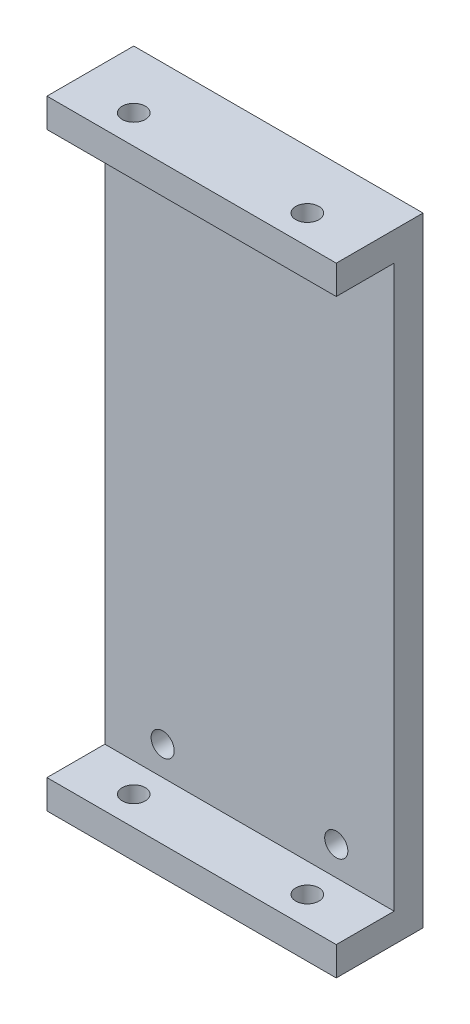
ISO-10303-21;
HEADER;
FILE_DESCRIPTION(('STEP AP214'),'2;1');
FILE_NAME('part.step','',(''),(''),'','','');
FILE_SCHEMA(('AUTOMOTIVE_DESIGN { 1 0 10303 214 1 1 1 1 }'));
ENDSEC;
DATA;
#1=APPLICATION_CONTEXT('core data for automotive mechanical design processes');
#2=APPLICATION_PROTOCOL_DEFINITION('international standard','automotive_design',2000,#1);
#3=PRODUCT_CONTEXT('',#1,'mechanical');
#4=PRODUCT('Part','Part','',(#3));
#5=PRODUCT_RELATED_PRODUCT_CATEGORY('part','',(#4));
#6=PRODUCT_DEFINITION_FORMATION('','',#4);
#7=PRODUCT_DEFINITION_CONTEXT('part definition',#1,'design');
#8=PRODUCT_DEFINITION('design','',#6,#7);
#9=PRODUCT_DEFINITION_SHAPE('','',#8);
#10=(LENGTH_UNIT() NAMED_UNIT(*) SI_UNIT(.MILLI.,.METRE.));
#11=(NAMED_UNIT(*) PLANE_ANGLE_UNIT() SI_UNIT($,.RADIAN.));
#12=(NAMED_UNIT(*) SI_UNIT($,.STERADIAN.) SOLID_ANGLE_UNIT());
#13=UNCERTAINTY_MEASURE_WITH_UNIT(LENGTH_MEASURE(1.E-05),#10,'distance_accuracy_value','');
#14=(GEOMETRIC_REPRESENTATION_CONTEXT(3) GLOBAL_UNCERTAINTY_ASSIGNED_CONTEXT((#13)) GLOBAL_UNIT_ASSIGNED_CONTEXT((#10,
#11,#12)) REPRESENTATION_CONTEXT('',''));
#15=CARTESIAN_POINT('',(0.,0.,0.));
#16=DIRECTION('',(0.,0.,1.));
#17=DIRECTION('',(1.,0.,0.));
#18=AXIS2_PLACEMENT_3D('',#15,#16,#17);
#19=CARTESIAN_POINT('',(0.,0.,0.));
#20=DIRECTION('',(0.,-1.,0.));
#21=DIRECTION('',(0.,0.,-1.));
#22=AXIS2_PLACEMENT_3D('',#19,#20,#21);
#23=PLANE('',#22);
#24=CARTESIAN_POINT('',(-15.,0.,2.5));
#25=DIRECTION('',(0.,1.,0.));
#26=DIRECTION('',(0.,0.,1.));
#27=AXIS2_PLACEMENT_3D('',#24,#25,#26);
#28=CIRCLE('',#27,1.99999999999999);
#29=CARTESIAN_POINT('',(-15.,0.,4.49999999999999));
#30=VERTEX_POINT('',#29);
#31=EDGE_CURVE('E372',#30,#30,#28,.T.);
#32=ORIENTED_EDGE('',*,*,#31,.F.);
#33=EDGE_LOOP('',(#32));
#34=FACE_BOUND('',#33,.T.);
#35=CARTESIAN_POINT('',(15.,0.,2.5));
#36=DIRECTION('',(0.,1.,0.));
#37=DIRECTION('',(0.,0.,1.));
#38=AXIS2_PLACEMENT_3D('',#35,#36,#37);
#39=CIRCLE('',#38,1.99999999999999);
#40=CARTESIAN_POINT('',(15.,0.,4.49999999999999));
#41=VERTEX_POINT('',#40);
#42=EDGE_CURVE('E369',#41,#41,#39,.T.);
#43=ORIENTED_EDGE('',*,*,#42,.F.);
#44=EDGE_LOOP('',(#43));
#45=FACE_BOUND('',#44,.T.);
#46=DIRECTION('',(1.,0.,0.));
#47=VECTOR('',#46,1.);
#48=CARTESIAN_POINT('',(-25.,0.,-2.5));
#49=LINE('',#48,#47);
#50=CARTESIAN_POINT('',(-25.,0.,-2.5));
#51=VERTEX_POINT('',#50);
#52=CARTESIAN_POINT('',(25.,0.,-2.5));
#53=VERTEX_POINT('',#52);
#54=EDGE_CURVE('E57',#51,#53,#49,.T.);
#55=ORIENTED_EDGE('',*,*,#54,.F.);
#56=DIRECTION('',(0.,0.,1.));
#57=VECTOR('',#56,1.);
#58=CARTESIAN_POINT('',(-25.,0.,7.5));
#59=LINE('',#58,#57);
#60=CARTESIAN_POINT('',(-25.,0.,7.5));
#61=VERTEX_POINT('',#60);
#62=EDGE_CURVE('E162',#51,#61,#59,.T.);
#63=ORIENTED_EDGE('',*,*,#62,.T.);
#64=DIRECTION('',(1.,0.,0.));
#65=VECTOR('',#64,1.);
#66=CARTESIAN_POINT('',(-25.,0.,7.5));
#67=LINE('',#66,#65);
#68=CARTESIAN_POINT('',(25.,0.,7.5));
#69=VERTEX_POINT('',#68);
#70=EDGE_CURVE('E154',#61,#69,#67,.T.);
#71=ORIENTED_EDGE('',*,*,#70,.T.);
#72=DIRECTION('',(0.,0.,-1.));
#73=VECTOR('',#72,1.);
#74=CARTESIAN_POINT('',(25.,0.,7.5));
#75=LINE('',#74,#73);
#76=EDGE_CURVE('E151',#69,#53,#75,.T.);
#77=ORIENTED_EDGE('',*,*,#76,.T.);
#78=EDGE_LOOP('',(#55,#63,#71,#77));
#79=FACE_BOUND('',#78,.T.);
#80=ADVANCED_FACE('F39',(#34,#45,#79),#23,.F.);
#81=CARTESIAN_POINT('',(25.,-5.,7.5));
#82=DIRECTION('',(1.,0.,0.));
#83=DIRECTION('',(0.,0.,-1.));
#84=AXIS2_PLACEMENT_3D('',#81,#82,#83);
#85=PLANE('',#84);
#86=ORIENTED_EDGE('',*,*,#76,.F.);
#87=DIRECTION('',(0.,1.,0.));
#88=VECTOR('',#87,1.);
#89=CARTESIAN_POINT('',(25.,-5.,7.5));
#90=LINE('',#89,#88);
#91=CARTESIAN_POINT('',(25.,-5.,7.5));
#92=VERTEX_POINT('',#91);
#93=EDGE_CURVE('E11',#92,#69,#90,.T.);
#94=ORIENTED_EDGE('',*,*,#93,.F.);
#95=DIRECTION('',(0.,0.,-1.));
#96=VECTOR('',#95,1.);
#97=CARTESIAN_POINT('',(25.,-5.,7.5));
#98=LINE('',#97,#96);
#99=CARTESIAN_POINT('',(25.,-5.,-7.5));
#100=VERTEX_POINT('',#99);
#101=EDGE_CURVE('E155',#92,#100,#98,.T.);
#102=ORIENTED_EDGE('',*,*,#101,.T.);
#103=DIRECTION('',(0.,1.,0.));
#104=VECTOR('',#103,1.);
#105=CARTESIAN_POINT('',(25.,-5.,-7.5));
#106=LINE('',#105,#104);
#107=CARTESIAN_POINT('',(25.,102.,-7.5));
#108=VERTEX_POINT('',#107);
#109=EDGE_CURVE('E43',#100,#108,#106,.T.);
#110=ORIENTED_EDGE('',*,*,#109,.T.);
#111=DIRECTION('',(0.,0.,-1.));
#112=VECTOR('',#111,1.);
#113=CARTESIAN_POINT('',(25.,102.,-7.5));
#114=LINE('',#113,#112);
#115=CARTESIAN_POINT('',(25.,102.,7.5));
#116=VERTEX_POINT('',#115);
#117=EDGE_CURVE('E125',#116,#108,#114,.T.);
#118=ORIENTED_EDGE('',*,*,#117,.F.);
#119=DIRECTION('',(0.,-1.,0.));
#120=VECTOR('',#119,1.);
#121=CARTESIAN_POINT('',(25.,102.,7.5));
#122=LINE('',#121,#120);
#123=CARTESIAN_POINT('',(25.,97.,7.5));
#124=VERTEX_POINT('',#123);
#125=EDGE_CURVE('E120',#116,#124,#122,.T.);
#126=ORIENTED_EDGE('',*,*,#125,.T.);
#127=DIRECTION('',(0.,0.,-1.));
#128=VECTOR('',#127,1.);
#129=CARTESIAN_POINT('',(25.,97.,-7.5));
#130=LINE('',#129,#128);
#131=CARTESIAN_POINT('',(25.,97.,-2.5));
#132=VERTEX_POINT('',#131);
#133=EDGE_CURVE('E128',#124,#132,#130,.T.);
#134=ORIENTED_EDGE('',*,*,#133,.T.);
#135=DIRECTION('',(0.,-1.,0.));
#136=VECTOR('',#135,1.);
#137=CARTESIAN_POINT('',(25.,97.,-2.5));
#138=LINE('',#137,#136);
#139=EDGE_CURVE('E145',#132,#53,#138,.T.);
#140=ORIENTED_EDGE('',*,*,#139,.T.);
#141=EDGE_LOOP('',(#86,#94,#102,#110,#118,#126,#134,#140));
#142=FACE_BOUND('',#141,.T.);
#143=ADVANCED_FACE('F41',(#142),#85,.T.);
#144=CARTESIAN_POINT('',(-25.,-5.,7.5));
#145=DIRECTION('',(0.,0.,1.));
#146=DIRECTION('',(1.,0.,0.));
#147=AXIS2_PLACEMENT_3D('',#144,#145,#146);
#148=PLANE('',#147);
#149=ORIENTED_EDGE('',*,*,#70,.F.);
#150=DIRECTION('',(0.,1.,0.));
#151=VECTOR('',#150,1.);
#152=CARTESIAN_POINT('',(-25.,-5.,7.5));
#153=LINE('',#152,#151);
#154=CARTESIAN_POINT('',(-25.,-5.,7.5));
#155=VERTEX_POINT('',#154);
#156=EDGE_CURVE('E48',#155,#61,#153,.T.);
#157=ORIENTED_EDGE('',*,*,#156,.F.);
#158=DIRECTION('',(1.,0.,0.));
#159=VECTOR('',#158,1.);
#160=CARTESIAN_POINT('',(-25.,-5.,7.5));
#161=LINE('',#160,#159);
#162=EDGE_CURVE('E159',#155,#92,#161,.T.);
#163=ORIENTED_EDGE('',*,*,#162,.T.);
#164=ORIENTED_EDGE('',*,*,#93,.T.);
#165=EDGE_LOOP('',(#149,#157,#163,#164));
#166=FACE_BOUND('',#165,.T.);
#167=ADVANCED_FACE('F185',(#166),#148,.T.);
#168=CARTESIAN_POINT('',(-25.,-5.,7.5));
#169=DIRECTION('',(-1.,0.,0.));
#170=DIRECTION('',(0.,0.,1.));
#171=AXIS2_PLACEMENT_3D('',#168,#169,#170);
#172=PLANE('',#171);
#173=ORIENTED_EDGE('',*,*,#62,.F.);
#174=DIRECTION('',(0.,-1.,0.));
#175=VECTOR('',#174,1.);
#176=CARTESIAN_POINT('',(-25.,97.,-2.5));
#177=LINE('',#176,#175);
#178=CARTESIAN_POINT('',(-25.,97.,-2.5));
#179=VERTEX_POINT('',#178);
#180=EDGE_CURVE('E146',#179,#51,#177,.T.);
#181=ORIENTED_EDGE('',*,*,#180,.F.);
#182=DIRECTION('',(0.,0.,1.));
#183=VECTOR('',#182,1.);
#184=CARTESIAN_POINT('',(-25.,97.,-7.5));
#185=LINE('',#184,#183);
#186=CARTESIAN_POINT('',(-25.,97.,7.5));
#187=VERTEX_POINT('',#186);
#188=EDGE_CURVE('E132',#179,#187,#185,.T.);
#189=ORIENTED_EDGE('',*,*,#188,.T.);
#190=DIRECTION('',(0.,-1.,0.));
#191=VECTOR('',#190,1.);
#192=CARTESIAN_POINT('',(-25.,102.,7.5));
#193=LINE('',#192,#191);
#194=CARTESIAN_POINT('',(-25.,102.,7.5));
#195=VERTEX_POINT('',#194);
#196=EDGE_CURVE('E119',#195,#187,#193,.T.);
#197=ORIENTED_EDGE('',*,*,#196,.F.);
#198=DIRECTION('',(0.,0.,1.));
#199=VECTOR('',#198,1.);
#200=CARTESIAN_POINT('',(-25.,102.,-7.5));
#201=LINE('',#200,#199);
#202=CARTESIAN_POINT('',(-25.,102.,-7.5));
#203=VERTEX_POINT('',#202);
#204=EDGE_CURVE('E121',#203,#195,#201,.T.);
#205=ORIENTED_EDGE('',*,*,#204,.F.);
#206=DIRECTION('',(0.,1.,0.));
#207=VECTOR('',#206,1.);
#208=CARTESIAN_POINT('',(-25.,-5.,-7.5));
#209=LINE('',#208,#207);
#210=CARTESIAN_POINT('',(-25.,-5.,-7.5));
#211=VERTEX_POINT('',#210);
#212=EDGE_CURVE('E169',#211,#203,#209,.T.);
#213=ORIENTED_EDGE('',*,*,#212,.F.);
#214=DIRECTION('',(0.,0.,1.));
#215=VECTOR('',#214,1.);
#216=CARTESIAN_POINT('',(-25.,-5.,7.5));
#217=LINE('',#216,#215);
#218=EDGE_CURVE('E160',#211,#155,#217,.T.);
#219=ORIENTED_EDGE('',*,*,#218,.T.);
#220=ORIENTED_EDGE('',*,*,#156,.T.);
#221=EDGE_LOOP('',(#173,#181,#189,#197,#205,#213,#219,#220));
#222=FACE_BOUND('',#221,.T.);
#223=ADVANCED_FACE('F131',(#222),#172,.T.);
#224=CARTESIAN_POINT('',(-25.,-5.,-7.5));
#225=DIRECTION('',(0.,0.,-1.));
#226=DIRECTION('',(-1.,0.,0.));
#227=AXIS2_PLACEMENT_3D('',#224,#225,#226);
#228=PLANE('',#227);
#229=CARTESIAN_POINT('',(-15.,5.,-7.5));
#230=DIRECTION('',(0.,0.,1.));
#231=DIRECTION('',(1.,0.,0.));
#232=AXIS2_PLACEMENT_3D('',#229,#230,#231);
#233=CIRCLE('',#232,1.99999999999999);
#234=CARTESIAN_POINT('',(-13.,5.,-7.5));
#235=VERTEX_POINT('',#234);
#236=EDGE_CURVE('E357',#235,#235,#233,.T.);
#237=ORIENTED_EDGE('',*,*,#236,.T.);
#238=EDGE_LOOP('',(#237));
#239=FACE_BOUND('',#238,.T.);
#240=CARTESIAN_POINT('',(15.,5.,-7.5));
#241=DIRECTION('',(0.,0.,1.));
#242=DIRECTION('',(1.,0.,0.));
#243=AXIS2_PLACEMENT_3D('',#240,#241,#242);
#244=CIRCLE('',#243,1.99999999999999);
#245=CARTESIAN_POINT('',(17.,5.,-7.5));
#246=VERTEX_POINT('',#245);
#247=EDGE_CURVE('E353',#246,#246,#244,.T.);
#248=ORIENTED_EDGE('',*,*,#247,.T.);
#249=EDGE_LOOP('',(#248));
#250=FACE_BOUND('',#249,.T.);
#251=CARTESIAN_POINT('',(-15.,92.,-7.50000000000001));
#252=DIRECTION('',(0.,0.,1.));
#253=DIRECTION('',(1.,0.,0.));
#254=AXIS2_PLACEMENT_3D('',#251,#252,#253);
#255=CIRCLE('',#254,1.99999999999999);
#256=CARTESIAN_POINT('',(-13.,92.,-7.50000000000001));
#257=VERTEX_POINT('',#256);
#258=EDGE_CURVE('E346',#257,#257,#255,.T.);
#259=ORIENTED_EDGE('',*,*,#258,.T.);
#260=EDGE_LOOP('',(#259));
#261=FACE_BOUND('',#260,.T.);
#262=CARTESIAN_POINT('',(15.,92.,-7.5));
#263=DIRECTION('',(0.,0.,1.));
#264=DIRECTION('',(1.,0.,0.));
#265=AXIS2_PLACEMENT_3D('',#262,#263,#264);
#266=CIRCLE('',#265,1.99999999999999);
#267=CARTESIAN_POINT('',(17.,92.,-7.5));
#268=VERTEX_POINT('',#267);
#269=EDGE_CURVE('E345',#268,#268,#266,.T.);
#270=ORIENTED_EDGE('',*,*,#269,.T.);
#271=EDGE_LOOP('',(#270));
#272=FACE_BOUND('',#271,.T.);
#273=ORIENTED_EDGE('',*,*,#212,.T.);
#274=DIRECTION('',(-1.,0.,0.));
#275=VECTOR('',#274,1.);
#276=CARTESIAN_POINT('',(-25.,102.,-7.5));
#277=LINE('',#276,#275);
#278=EDGE_CURVE('E126',#108,#203,#277,.T.);
#279=ORIENTED_EDGE('',*,*,#278,.F.);
#280=ORIENTED_EDGE('',*,*,#109,.F.);
#281=DIRECTION('',(-1.,0.,0.));
#282=VECTOR('',#281,1.);
#283=CARTESIAN_POINT('',(-25.,-5.,-7.5));
#284=LINE('',#283,#282);
#285=EDGE_CURVE('E152',#100,#211,#284,.T.);
#286=ORIENTED_EDGE('',*,*,#285,.T.);
#287=EDGE_LOOP('',(#273,#279,#280,#286));
#288=FACE_BOUND('',#287,.T.);
#289=ADVANCED_FACE('F168',(#239,#250,#261,#272,#288),#228,.T.);
#290=CARTESIAN_POINT('',(0.,-5.,0.));
#291=DIRECTION('',(0.,-1.,0.));
#292=DIRECTION('',(0.,0.,-1.));
#293=AXIS2_PLACEMENT_3D('',#290,#291,#292);
#294=PLANE('',#293);
#295=CARTESIAN_POINT('',(-15.,-5.00000000000001,2.5));
#296=DIRECTION('',(0.,1.,0.));
#297=DIRECTION('',(0.,0.,1.));
#298=AXIS2_PLACEMENT_3D('',#295,#296,#297);
#299=CIRCLE('',#298,1.99999999999999);
#300=CARTESIAN_POINT('',(-15.,-5.00000000000001,4.49999999999999));
#301=VERTEX_POINT('',#300);
#302=EDGE_CURVE('E375',#301,#301,#299,.T.);
#303=ORIENTED_EDGE('',*,*,#302,.T.);
#304=EDGE_LOOP('',(#303));
#305=FACE_BOUND('',#304,.T.);
#306=CARTESIAN_POINT('',(15.,-5.00000000000001,2.5));
#307=DIRECTION('',(0.,1.,0.));
#308=DIRECTION('',(0.,0.,1.));
#309=AXIS2_PLACEMENT_3D('',#306,#307,#308);
#310=CIRCLE('',#309,1.99999999999999);
#311=CARTESIAN_POINT('',(15.,-5.00000000000001,4.49999999999999));
#312=VERTEX_POINT('',#311);
#313=EDGE_CURVE('E368',#312,#312,#310,.T.);
#314=ORIENTED_EDGE('',*,*,#313,.T.);
#315=EDGE_LOOP('',(#314));
#316=FACE_BOUND('',#315,.T.);
#317=ORIENTED_EDGE('',*,*,#101,.F.);
#318=ORIENTED_EDGE('',*,*,#162,.F.);
#319=ORIENTED_EDGE('',*,*,#218,.F.);
#320=ORIENTED_EDGE('',*,*,#285,.F.);
#321=EDGE_LOOP('',(#317,#318,#319,#320));
#322=FACE_BOUND('',#321,.T.);
#323=ADVANCED_FACE('F189',(#305,#316,#322),#294,.T.);
#324=CARTESIAN_POINT('',(-25.,97.,-2.5));
#325=DIRECTION('',(0.,0.,-1.));
#326=DIRECTION('',(-1.,0.,0.));
#327=AXIS2_PLACEMENT_3D('',#324,#325,#326);
#328=PLANE('',#327);
#329=CARTESIAN_POINT('',(-15.,5.,-2.5));
#330=DIRECTION('',(0.,0.,1.));
#331=DIRECTION('',(1.,0.,0.));
#332=AXIS2_PLACEMENT_3D('',#329,#330,#331);
#333=CIRCLE('',#332,1.99999999999999);
#334=CARTESIAN_POINT('',(-13.,5.,-2.5));
#335=VERTEX_POINT('',#334);
#336=EDGE_CURVE('E361',#335,#335,#333,.T.);
#337=ORIENTED_EDGE('',*,*,#336,.F.);
#338=EDGE_LOOP('',(#337));
#339=FACE_BOUND('',#338,.T.);
#340=CARTESIAN_POINT('',(15.,5.,-2.5));
#341=DIRECTION('',(0.,0.,1.));
#342=DIRECTION('',(1.,0.,0.));
#343=AXIS2_PLACEMENT_3D('',#340,#341,#342);
#344=CIRCLE('',#343,1.99999999999999);
#345=CARTESIAN_POINT('',(17.,5.,-2.5));
#346=VERTEX_POINT('',#345);
#347=EDGE_CURVE('E360',#346,#346,#344,.T.);
#348=ORIENTED_EDGE('',*,*,#347,.F.);
#349=EDGE_LOOP('',(#348));
#350=FACE_BOUND('',#349,.T.);
#351=CARTESIAN_POINT('',(-15.,92.,-2.5));
#352=DIRECTION('',(0.,0.,1.));
#353=DIRECTION('',(1.,0.,0.));
#354=AXIS2_PLACEMENT_3D('',#351,#352,#353);
#355=CIRCLE('',#354,1.99999999999999);
#356=CARTESIAN_POINT('',(-13.,92.,-2.5));
#357=VERTEX_POINT('',#356);
#358=EDGE_CURVE('E354',#357,#357,#355,.T.);
#359=ORIENTED_EDGE('',*,*,#358,.F.);
#360=EDGE_LOOP('',(#359));
#361=FACE_BOUND('',#360,.T.);
#362=CARTESIAN_POINT('',(15.,92.,-2.5));
#363=DIRECTION('',(0.,0.,1.));
#364=DIRECTION('',(1.,0.,0.));
#365=AXIS2_PLACEMENT_3D('',#362,#363,#364);
#366=CIRCLE('',#365,1.99999999999999);
#367=CARTESIAN_POINT('',(17.,92.,-2.5));
#368=VERTEX_POINT('',#367);
#369=EDGE_CURVE('E342',#368,#368,#366,.T.);
#370=ORIENTED_EDGE('',*,*,#369,.F.);
#371=EDGE_LOOP('',(#370));
#372=FACE_BOUND('',#371,.T.);
#373=ORIENTED_EDGE('',*,*,#54,.T.);
#374=ORIENTED_EDGE('',*,*,#139,.F.);
#375=DIRECTION('',(1.,0.,0.));
#376=VECTOR('',#375,1.);
#377=CARTESIAN_POINT('',(-25.,97.,-2.5));
#378=LINE('',#377,#376);
#379=EDGE_CURVE('E136',#179,#132,#378,.T.);
#380=ORIENTED_EDGE('',*,*,#379,.F.);
#381=ORIENTED_EDGE('',*,*,#180,.T.);
#382=EDGE_LOOP('',(#373,#374,#380,#381));
#383=FACE_BOUND('',#382,.T.);
#384=ADVANCED_FACE('F182',(#339,#350,#361,#372,#383),#328,.F.);
#385=CARTESIAN_POINT('',(0.,97.,0.));
#386=DIRECTION('',(0.,1.,0.));
#387=DIRECTION('',(0.,0.,1.));
#388=AXIS2_PLACEMENT_3D('',#385,#386,#387);
#389=PLANE('',#388);
#390=CARTESIAN_POINT('',(15.,97.,2.5));
#391=DIRECTION('',(0.,-1.,0.));
#392=DIRECTION('',(0.,0.,-1.));
#393=AXIS2_PLACEMENT_3D('',#390,#391,#392);
#394=CIRCLE('',#393,1.99999999999999);
#395=CARTESIAN_POINT('',(15.,97.,0.500000000000012));
#396=VERTEX_POINT('',#395);
#397=EDGE_CURVE('E328',#396,#396,#394,.T.);
#398=ORIENTED_EDGE('',*,*,#397,.F.);
#399=EDGE_LOOP('',(#398));
#400=FACE_BOUND('',#399,.T.);
#401=CARTESIAN_POINT('',(-15.,97.,2.5));
#402=DIRECTION('',(0.,-1.,0.));
#403=DIRECTION('',(0.,0.,-1.));
#404=AXIS2_PLACEMENT_3D('',#401,#402,#403);
#405=CIRCLE('',#404,1.99999999999999);
#406=CARTESIAN_POINT('',(-15.,97.,0.500000000000012));
#407=VERTEX_POINT('',#406);
#408=EDGE_CURVE('E335',#407,#407,#405,.T.);
#409=ORIENTED_EDGE('',*,*,#408,.F.);
#410=EDGE_LOOP('',(#409));
#411=FACE_BOUND('',#410,.T.);
#412=ORIENTED_EDGE('',*,*,#188,.F.);
#413=ORIENTED_EDGE('',*,*,#379,.T.);
#414=ORIENTED_EDGE('',*,*,#133,.F.);
#415=DIRECTION('',(1.,0.,0.));
#416=VECTOR('',#415,1.);
#417=CARTESIAN_POINT('',(-25.,97.,7.5));
#418=LINE('',#417,#416);
#419=EDGE_CURVE('E173',#187,#124,#418,.T.);
#420=ORIENTED_EDGE('',*,*,#419,.F.);
#421=EDGE_LOOP('',(#412,#413,#414,#420));
#422=FACE_BOUND('',#421,.T.);
#423=ADVANCED_FACE('F179',(#400,#411,#422),#389,.F.);
#424=CARTESIAN_POINT('',(-25.,102.,7.5));
#425=DIRECTION('',(0.,0.,-1.));
#426=DIRECTION('',(-1.,0.,0.));
#427=AXIS2_PLACEMENT_3D('',#424,#425,#426);
#428=PLANE('',#427);
#429=ORIENTED_EDGE('',*,*,#419,.T.);
#430=ORIENTED_EDGE('',*,*,#125,.F.);
#431=DIRECTION('',(1.,0.,0.));
#432=VECTOR('',#431,1.);
#433=CARTESIAN_POINT('',(-25.,102.,7.5));
#434=LINE('',#433,#432);
#435=EDGE_CURVE('E115',#195,#116,#434,.T.);
#436=ORIENTED_EDGE('',*,*,#435,.F.);
#437=ORIENTED_EDGE('',*,*,#196,.T.);
#438=EDGE_LOOP('',(#429,#430,#436,#437));
#439=FACE_BOUND('',#438,.T.);
#440=ADVANCED_FACE('F111',(#439),#428,.F.);
#441=CARTESIAN_POINT('',(0.,102.,0.));
#442=DIRECTION('',(0.,1.,0.));
#443=DIRECTION('',(0.,0.,1.));
#444=AXIS2_PLACEMENT_3D('',#441,#442,#443);
#445=PLANE('',#444);
#446=CARTESIAN_POINT('',(15.,102.,2.5));
#447=DIRECTION('',(0.,-1.,0.));
#448=DIRECTION('',(0.,0.,-1.));
#449=AXIS2_PLACEMENT_3D('',#446,#447,#448);
#450=CIRCLE('',#449,1.99999999999999);
#451=CARTESIAN_POINT('',(15.,102.,0.500000000000012));
#452=VERTEX_POINT('',#451);
#453=EDGE_CURVE('E331',#452,#452,#450,.T.);
#454=ORIENTED_EDGE('',*,*,#453,.T.);
#455=EDGE_LOOP('',(#454));
#456=FACE_BOUND('',#455,.T.);
#457=CARTESIAN_POINT('',(-15.,102.,2.5));
#458=DIRECTION('',(0.,-1.,0.));
#459=DIRECTION('',(0.,0.,-1.));
#460=AXIS2_PLACEMENT_3D('',#457,#458,#459);
#461=CIRCLE('',#460,1.99999999999999);
#462=CARTESIAN_POINT('',(-15.,102.,0.500000000000012));
#463=VERTEX_POINT('',#462);
#464=EDGE_CURVE('E172',#463,#463,#461,.T.);
#465=ORIENTED_EDGE('',*,*,#464,.T.);
#466=EDGE_LOOP('',(#465));
#467=FACE_BOUND('',#466,.T.);
#468=ORIENTED_EDGE('',*,*,#204,.T.);
#469=ORIENTED_EDGE('',*,*,#435,.T.);
#470=ORIENTED_EDGE('',*,*,#117,.T.);
#471=ORIENTED_EDGE('',*,*,#278,.T.);
#472=EDGE_LOOP('',(#468,#469,#470,#471));
#473=FACE_BOUND('',#472,.T.);
#474=ADVANCED_FACE('F130',(#456,#467,#473),#445,.T.);
#475=CARTESIAN_POINT('',(-15.,97.,2.5));
#476=DIRECTION('',(0.,-1.,0.));
#477=DIRECTION('',(0.,0.,-1.));
#478=AXIS2_PLACEMENT_3D('',#475,#476,#477);
#479=CYLINDRICAL_SURFACE('',#478,1.99999999999999);
#480=ORIENTED_EDGE('',*,*,#464,.F.);
#481=EDGE_LOOP('',(#480));
#482=FACE_BOUND('',#481,.T.);
#483=ORIENTED_EDGE('',*,*,#408,.T.);
#484=EDGE_LOOP('',(#483));
#485=FACE_BOUND('',#484,.T.);
#486=ADVANCED_FACE('F236',(#482,#485),#479,.F.);
#487=CARTESIAN_POINT('',(15.,97.,2.5));
#488=DIRECTION('',(0.,-1.,0.));
#489=DIRECTION('',(0.,0.,-1.));
#490=AXIS2_PLACEMENT_3D('',#487,#488,#489);
#491=CYLINDRICAL_SURFACE('',#490,1.99999999999999);
#492=ORIENTED_EDGE('',*,*,#453,.F.);
#493=EDGE_LOOP('',(#492));
#494=FACE_BOUND('',#493,.T.);
#495=ORIENTED_EDGE('',*,*,#397,.T.);
#496=EDGE_LOOP('',(#495));
#497=FACE_BOUND('',#496,.T.);
#498=ADVANCED_FACE('F246',(#494,#497),#491,.F.);
#499=CARTESIAN_POINT('',(15.,92.,-2.5));
#500=DIRECTION('',(0.,0.,1.));
#501=DIRECTION('',(1.,0.,0.));
#502=AXIS2_PLACEMENT_3D('',#499,#500,#501);
#503=CYLINDRICAL_SURFACE('',#502,1.99999999999999);
#504=ORIENTED_EDGE('',*,*,#269,.F.);
#505=EDGE_LOOP('',(#504));
#506=FACE_BOUND('',#505,.T.);
#507=ORIENTED_EDGE('',*,*,#369,.T.);
#508=EDGE_LOOP('',(#507));
#509=FACE_BOUND('',#508,.T.);
#510=ADVANCED_FACE('F256',(#506,#509),#503,.F.);
#511=CARTESIAN_POINT('',(-15.,92.,-2.5));
#512=DIRECTION('',(0.,0.,1.));
#513=DIRECTION('',(1.,0.,0.));
#514=AXIS2_PLACEMENT_3D('',#511,#512,#513);
#515=CYLINDRICAL_SURFACE('',#514,1.99999999999999);
#516=ORIENTED_EDGE('',*,*,#258,.F.);
#517=EDGE_LOOP('',(#516));
#518=FACE_BOUND('',#517,.T.);
#519=ORIENTED_EDGE('',*,*,#358,.T.);
#520=EDGE_LOOP('',(#519));
#521=FACE_BOUND('',#520,.T.);
#522=ADVANCED_FACE('F268',(#518,#521),#515,.F.);
#523=CARTESIAN_POINT('',(15.,5.,-2.5));
#524=DIRECTION('',(0.,0.,1.));
#525=DIRECTION('',(1.,0.,0.));
#526=AXIS2_PLACEMENT_3D('',#523,#524,#525);
#527=CYLINDRICAL_SURFACE('',#526,1.99999999999999);
#528=ORIENTED_EDGE('',*,*,#247,.F.);
#529=EDGE_LOOP('',(#528));
#530=FACE_BOUND('',#529,.T.);
#531=ORIENTED_EDGE('',*,*,#347,.T.);
#532=EDGE_LOOP('',(#531));
#533=FACE_BOUND('',#532,.T.);
#534=ADVANCED_FACE('F279',(#530,#533),#527,.F.);
#535=CARTESIAN_POINT('',(-15.,5.,-2.5));
#536=DIRECTION('',(0.,0.,1.));
#537=DIRECTION('',(1.,0.,0.));
#538=AXIS2_PLACEMENT_3D('',#535,#536,#537);
#539=CYLINDRICAL_SURFACE('',#538,1.99999999999999);
#540=ORIENTED_EDGE('',*,*,#236,.F.);
#541=EDGE_LOOP('',(#540));
#542=FACE_BOUND('',#541,.T.);
#543=ORIENTED_EDGE('',*,*,#336,.T.);
#544=EDGE_LOOP('',(#543));
#545=FACE_BOUND('',#544,.T.);
#546=ADVANCED_FACE('F286',(#542,#545),#539,.F.);
#547=CARTESIAN_POINT('',(15.,0.,2.5));
#548=DIRECTION('',(0.,1.,0.));
#549=DIRECTION('',(0.,0.,1.));
#550=AXIS2_PLACEMENT_3D('',#547,#548,#549);
#551=CYLINDRICAL_SURFACE('',#550,1.99999999999999);
#552=ORIENTED_EDGE('',*,*,#313,.F.);
#553=EDGE_LOOP('',(#552));
#554=FACE_BOUND('',#553,.T.);
#555=ORIENTED_EDGE('',*,*,#42,.T.);
#556=EDGE_LOOP('',(#555));
#557=FACE_BOUND('',#556,.T.);
#558=ADVANCED_FACE('F300',(#554,#557),#551,.F.);
#559=CARTESIAN_POINT('',(-15.,0.,2.5));
#560=DIRECTION('',(0.,1.,0.));
#561=DIRECTION('',(0.,0.,1.));
#562=AXIS2_PLACEMENT_3D('',#559,#560,#561);
#563=CYLINDRICAL_SURFACE('',#562,1.99999999999999);
#564=ORIENTED_EDGE('',*,*,#302,.F.);
#565=EDGE_LOOP('',(#564));
#566=FACE_BOUND('',#565,.T.);
#567=ORIENTED_EDGE('',*,*,#31,.T.);
#568=EDGE_LOOP('',(#567));
#569=FACE_BOUND('',#568,.T.);
#570=ADVANCED_FACE('F306',(#566,#569),#563,.F.);
#571=CLOSED_SHELL('',(#80,#143,#167,#223,#289,#323,#384,#423,#440,#474,#486,#498,#510,#522,#534,
#546,#558,#570));
#572=MANIFOLD_SOLID_BREP('B2',#571);
#573=ADVANCED_BREP_SHAPE_REPRESENTATION('',(#18,#572),#14);
#574=SHAPE_DEFINITION_REPRESENTATION(#9,#573);
ENDSEC;
END-ISO-10303-21;
